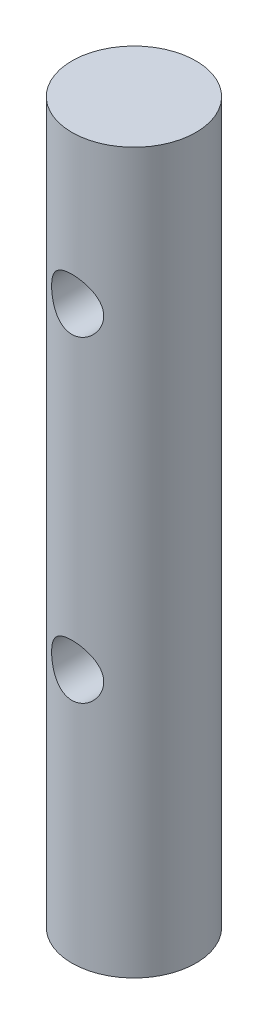
ISO-10303-21;
HEADER;
FILE_DESCRIPTION(('STEP AP214'),'2;1');
FILE_NAME('part.step','',(''),(''),'','','');
FILE_SCHEMA(('AUTOMOTIVE_DESIGN { 1 0 10303 214 1 1 1 1 }'));
ENDSEC;
DATA;
#1=APPLICATION_CONTEXT('core data for automotive mechanical design processes');
#2=APPLICATION_PROTOCOL_DEFINITION('international standard','automotive_design',2000,#1);
#3=PRODUCT_CONTEXT('',#1,'mechanical');
#4=PRODUCT('Part','Part','',(#3));
#5=PRODUCT_RELATED_PRODUCT_CATEGORY('part','',(#4));
#6=PRODUCT_DEFINITION_FORMATION('','',#4);
#7=PRODUCT_DEFINITION_CONTEXT('part definition',#1,'design');
#8=PRODUCT_DEFINITION('design','',#6,#7);
#9=PRODUCT_DEFINITION_SHAPE('','',#8);
#10=(LENGTH_UNIT() NAMED_UNIT(*) SI_UNIT(.MILLI.,.METRE.));
#11=(NAMED_UNIT(*) PLANE_ANGLE_UNIT() SI_UNIT($,.RADIAN.));
#12=(NAMED_UNIT(*) SI_UNIT($,.STERADIAN.) SOLID_ANGLE_UNIT());
#13=UNCERTAINTY_MEASURE_WITH_UNIT(LENGTH_MEASURE(1.E-05),#10,'distance_accuracy_value','');
#14=(GEOMETRIC_REPRESENTATION_CONTEXT(3) GLOBAL_UNCERTAINTY_ASSIGNED_CONTEXT((#13)) GLOBAL_UNIT_ASSIGNED_CONTEXT((#10,
#11,#12)) REPRESENTATION_CONTEXT('',''));
#15=CARTESIAN_POINT('',(0.,0.,0.));
#16=DIRECTION('',(0.,0.,1.));
#17=DIRECTION('',(1.,0.,0.));
#18=AXIS2_PLACEMENT_3D('',#15,#16,#17);
#19=CARTESIAN_POINT('',(0.,58.,0.));
#20=DIRECTION('',(0.,-1.,0.));
#21=DIRECTION('',(0.,0.,-1.));
#22=AXIS2_PLACEMENT_3D('',#19,#20,#21);
#23=CYLINDRICAL_SURFACE('',#22,5.);
#24=CARTESIAN_POINT('',(0.,48.1,-5.));
#25=CARTESIAN_POINT('',(-0.112421260581154,48.0999912513358,-4.99999333081063));
#26=CARTESIAN_POINT('',(-0.225000407186862,48.0909214164188,-4.99616592841195));
#27=CARTESIAN_POINT('',(-0.446972248377445,48.0549745053768,-4.98123118003201));
#28=CARTESIAN_POINT('',(-0.556355935732331,48.0280513734512,-4.97010500635269));
#29=CARTESIAN_POINT('',(-0.768350398152641,47.9575669353113,-4.94176430599483));
#30=CARTESIAN_POINT('',(-0.870982883258441,47.9140623611996,-4.92457055376414));
#31=CARTESIAN_POINT('',(-1.06739278830026,47.8118871486583,-4.8857658190477));
#32=CARTESIAN_POINT('',(-1.16117280038009,47.7532209687109,-4.8641561355186));
#33=CARTESIAN_POINT('',(-1.3421338261388,47.6192383747268,-4.81744880427698));
#34=CARTESIAN_POINT('',(-1.42880573971969,47.5432749625455,-4.79223574286274));
#35=CARTESIAN_POINT('',(-1.58861874618107,47.3782228521662,-4.74165902719199));
#36=CARTESIAN_POINT('',(-1.66175260846298,47.2891271854696,-4.71629529988631));
#37=CARTESIAN_POINT('',(-1.79604183081054,47.0949219517323,-4.66686358992508));
#38=CARTESIAN_POINT('',(-1.85641196230061,46.989233155181,-4.64292449321021));
#39=CARTESIAN_POINT('',(-1.95829034529051,46.7680506363567,-4.60088674913594));
#40=CARTESIAN_POINT('',(-1.99980846754018,46.6525620828365,-4.58278504680928));
#41=CARTESIAN_POINT('',(-2.06069339629843,46.4209186251976,-4.55572282316871));
#42=CARTESIAN_POINT('',(-2.08104088310876,46.3050703250742,-4.54635990340002));
#43=CARTESIAN_POINT('',(-2.10206556458631,46.0712546231971,-4.53668036024208));
#44=CARTESIAN_POINT('',(-2.10275385885089,45.9532884548446,-4.53635863218973));
#45=CARTESIAN_POINT('',(-2.08517838863869,45.7284272657301,-4.54445782632958));
#46=CARTESIAN_POINT('',(-2.06839112114071,45.621387346636,-4.55219766109081));
#47=CARTESIAN_POINT('',(-2.01882069425823,45.4118140301093,-4.57439532890143));
#48=CARTESIAN_POINT('',(-1.98603441325927,45.3092815163873,-4.58885447294869));
#49=CARTESIAN_POINT('',(-1.9047552653891,45.1090228101453,-4.62318960000861));
#50=CARTESIAN_POINT('',(-1.8559407276577,45.0114467919097,-4.64317507109548));
#51=CARTESIAN_POINT('',(-1.74421855126709,44.8254875192443,-4.6862864975772));
#52=CARTESIAN_POINT('',(-1.68130530506479,44.7371079430947,-4.70941370110216));
#53=CARTESIAN_POINT('',(-1.53682141436928,44.5640504268353,-4.7586218987971));
#54=CARTESIAN_POINT('',(-1.4541115363858,44.480344491469,-4.78478586969401));
#55=CARTESIAN_POINT('',(-1.27557303481868,44.3276620651184,-4.83544396849842));
#56=CARTESIAN_POINT('',(-1.17974124865652,44.258689135302,-4.85993769171256));
#57=CARTESIAN_POINT('',(-0.974684985251582,44.1359738450041,-4.90522758617355));
#58=CARTESIAN_POINT('',(-0.865196096354342,44.0826329332761,-4.92592190978332));
#59=CARTESIAN_POINT('',(-0.637707645332218,43.9954695201198,-4.96049707707325));
#60=CARTESIAN_POINT('',(-0.519712906376768,43.9616360535945,-4.97438174778904));
#61=CARTESIAN_POINT('',(-0.286679920590253,43.9164964343609,-4.99305470954801));
#62=CARTESIAN_POINT('',(-0.171936368129356,43.9038862120167,-4.9983686606607));
#63=CARTESIAN_POINT('',(0.0581412446748186,43.8976556572538,-5.00098385227943));
#64=CARTESIAN_POINT('',(0.173475122118156,43.9040297609993,-4.99828744042502));
#65=CARTESIAN_POINT('',(0.395312373831663,43.9346587430673,-4.98552504990215));
#66=CARTESIAN_POINT('',(0.501967273863915,43.9579925247287,-4.9758388790051));
#67=CARTESIAN_POINT('',(0.709728637835151,44.0205906827834,-4.95047932164883));
#68=CARTESIAN_POINT('',(0.810834401783573,44.0598570637601,-4.93480518181903));
#69=CARTESIAN_POINT('',(1.00818189714743,44.1544869561539,-4.8983626516293));
#70=CARTESIAN_POINT('',(1.10417428723488,44.2103134514804,-4.87745088709504));
#71=CARTESIAN_POINT('',(1.2857730017409,44.3359708733449,-4.83275775989047));
#72=CARTESIAN_POINT('',(1.37137493586437,44.4058076868507,-4.80897519262204));
#73=CARTESIAN_POINT('',(1.53629380491232,44.5634290615289,-4.75896603015301));
#74=CARTESIAN_POINT('',(1.61470399849415,44.6521482285297,-4.73268731102285));
#75=CARTESIAN_POINT('',(1.75578239792248,44.8418945785711,-4.68218504424202));
#76=CARTESIAN_POINT('',(1.81844681280032,44.9429247169353,-4.65796199244367));
#77=CARTESIAN_POINT('',(1.92699302654219,45.1566323377572,-4.61412955516252));
#78=CARTESIAN_POINT('',(1.97260446871616,45.2694638769173,-4.59459611805935));
#79=CARTESIAN_POINT('',(2.04378702108546,45.5022855598323,-4.56338397318404));
#80=CARTESIAN_POINT('',(2.06937501482838,45.6222695806153,-4.55169864915186));
#81=CARTESIAN_POINT('',(2.098093753164,45.8559122777025,-4.53852721320537));
#82=CARTESIAN_POINT('',(2.10281966121278,45.9693349012228,-4.53631703032196));
#83=CARTESIAN_POINT('',(2.09395263112575,46.1952929462249,-4.54041709192145));
#84=CARTESIAN_POINT('',(2.0803626157943,46.3078285063796,-4.54672597695537));
#85=CARTESIAN_POINT('',(2.03659654382614,46.5232401848228,-4.56648699353873));
#86=CARTESIAN_POINT('',(2.00724892567788,46.626320610286,-4.57958128170967));
#87=CARTESIAN_POINT('',(1.93361811208319,46.826114240217,-4.61115138706684));
#88=CARTESIAN_POINT('',(1.88933070598751,46.9228256404356,-4.6296287212173));
#89=CARTESIAN_POINT('',(1.78398506506628,47.1135418518623,-4.67127236761429));
#90=CARTESIAN_POINT('',(1.72207244546472,47.2070265834229,-4.69465512938921));
#91=CARTESIAN_POINT('',(1.5844223678344,47.3827788256602,-4.74288120419634));
#92=CARTESIAN_POINT('',(1.50867999331674,47.4650423289533,-4.76772503450352));
#93=CARTESIAN_POINT('',(1.33881414331682,47.6223262248237,-4.81829681676583));
#94=CARTESIAN_POINT('',(1.24374163979691,47.6963503535757,-4.84395273633481));
#95=CARTESIAN_POINT('',(1.04160910493706,47.8274504328955,-4.89140406157461));
#96=CARTESIAN_POINT('',(0.934543653723438,47.8845186778333,-4.91319771021995));
#97=CARTESIAN_POINT('',(0.712909694659775,47.9788868855152,-4.9501639165207));
#98=CARTESIAN_POINT('',(0.598488891919439,48.0164889374133,-4.96543696653597));
#99=CARTESIAN_POINT('',(0.423046442527797,48.0578272578272,-4.98242021609108));
#100=CARTESIAN_POINT('',(0.363983932156321,48.0690926050424,-4.98709206933622));
#101=CARTESIAN_POINT('',(0.244993842675942,48.086523604976,-4.99434801176813));
#102=CARTESIAN_POINT('',(0.185066849625886,48.0926925613123,-4.99693345339788));
#103=CARTESIAN_POINT('',(0.0833788914689154,48.0987597905083,-4.99947925927613));
#104=CARTESIAN_POINT('',(0.0417003073719692,48.1000032451334,-5.00000247379584));
#105=CARTESIAN_POINT('',(0.,48.1,-5.));
#106=B_SPLINE_CURVE_WITH_KNOTS('',3,(#24,#25,#26,#27,#28,#29,#30,#31,#32,#33,#34,#35,#36,#37,
#38,#39,#40,#41,#42,#43,#44,#45,#46,#47,#48,#49,#50,#51,#52,#53,#54,#55,#56,#57,#58,#59,#60,#61,
#62,#63,#64,#65,#66,#67,#68,#69,#70,#71,#72,#73,#74,#75,#76,#77,#78,#79,#80,#81,#82,#83,#84,#85,
#86,#87,#88,#89,#90,#91,#92,#93,#94,#95,#96,#97,#98,#99,#100,#101,#102,#103,#104,#105),
.UNSPECIFIED.,.T.,.F.,(4,2,2,2,2,2,2,2,2,2,2,2,2,2,2,2,2,2,2,2,2,2,2,2,2,2,2,2,2,2,2,2,2,2,2,2,
2,2,2,2,4),(0.,0.337117852409668,0.675108761991063,1.0119534948119,1.34869928621511,
1.70109212353727,2.05367263229609,2.42394551964458,2.79402431110358,3.14607251211167,
3.49792194246532,3.82228185888045,4.14670508743038,4.47808378319006,4.809594514361,
5.16961532097002,5.5297230512783,5.89839924827032,6.26686801055252,6.61173647653921,
6.95650388006772,7.28382587678936,7.61118906878411,7.94874145558542,8.28643597605333,
8.64863382013132,9.01091878393075,9.37872565541545,9.74622206108766,10.0850701575655,
10.4238641880037,10.7463772236013,11.0689812327413,11.4111551885347,11.7534510251225,
12.1212491138851,12.4892140943469,12.851283305836,13.0320009112093,13.2126012784391,
13.3376480711311),.UNSPECIFIED.);
#107=CARTESIAN_POINT('',(0.,48.1,-5.));
#108=VERTEX_POINT('',#107);
#109=EDGE_CURVE('E10',#108,#108,#106,.T.);
#110=ORIENTED_EDGE('',*,*,#109,.T.);
#111=EDGE_LOOP('',(#110));
#112=FACE_BOUND('',#111,.T.);
#113=CARTESIAN_POINT('',(2.1,46.,4.53762052181537));
#114=CARTESIAN_POINT('',(2.09999093921855,45.8880749784205,4.53762943405603));
#115=CARTESIAN_POINT('',(2.09099762013233,45.7759853694105,4.54182056190798));
#116=CARTESIAN_POINT('',(2.05538295735073,45.5550390094382,4.5580436120359));
#117=CARTESIAN_POINT('',(2.02871409890585,45.4461918009732,4.57009666707434));
#118=CARTESIAN_POINT('',(1.95897145018737,45.2353378000576,4.60041935380906));
#119=CARTESIAN_POINT('',(1.91596526359135,45.1333048291412,4.61866333476091));
#120=CARTESIAN_POINT('',(1.81496848628035,44.937930449767,4.65927465681673));
#121=CARTESIAN_POINT('',(1.75698127255649,44.8445870889582,4.68164106832602));
#122=CARTESIAN_POINT('',(1.62374740147949,44.6632827566951,4.72955907129732));
#123=CARTESIAN_POINT('',(1.54770150900604,44.5759376667451,4.755219776632));
#124=CARTESIAN_POINT('',(1.3821867337842,44.4147841990692,4.8059388812481));
#125=CARTESIAN_POINT('',(1.29271265147996,44.3409810896727,4.83099704283744));
#126=CARTESIAN_POINT('',(1.09802657081059,44.2058477020417,4.87901754682324));
#127=CARTESIAN_POINT('',(0.992293792277617,44.1452128213258,4.90183831897403));
#128=CARTESIAN_POINT('',(0.770996800720701,44.0428577065274,4.94147445225016));
#129=CARTESIAN_POINT('',(0.655437046410571,44.0011289481343,4.95829251912189));
#130=CARTESIAN_POINT('',(0.424234923140875,43.9400103162658,4.98325405033125));
#131=CARTESIAN_POINT('',(0.308918758384999,43.9195577499202,4.99180846788813));
#132=CARTESIAN_POINT('',(0.0761953640483121,43.8981358141872,5.00077313697796));
#133=CARTESIAN_POINT('',(-0.0412109829216839,43.8971584076786,5.00118674810494));
#134=CARTESIAN_POINT('',(-0.267045691992889,43.9141629876689,4.99406347006893));
#135=CARTESIAN_POINT('',(-0.375580389240539,43.9309766718821,4.987016486703));
#136=CARTESIAN_POINT('',(-0.588121453972403,43.9810802318956,4.96643913228808));
#137=CARTESIAN_POINT('',(-0.692127486752447,44.0143713232657,4.95290828291428));
#138=CARTESIAN_POINT('',(-0.894571592733619,44.0968770843797,4.92040872616598));
#139=CARTESIAN_POINT('',(-0.992900328996023,44.1463272516458,4.90136010164063));
#140=CARTESIAN_POINT('',(-1.18012201231841,44.2595144447498,4.85968358817454));
#141=CARTESIAN_POINT('',(-1.26901159117052,44.3232565453523,4.83705442870328));
#142=CARTESIAN_POINT('',(-1.44158231126841,44.4685132513924,4.78857382294645));
#143=CARTESIAN_POINT('',(-1.52443735050639,44.5509723739513,4.76260766855617));
#144=CARTESIAN_POINT('',(-1.67550358285698,44.7286640422807,4.71158770832487));
#145=CARTESIAN_POINT('',(-1.74370894230208,44.8239016521529,4.68653426922283));
#146=CARTESIAN_POINT('',(-1.8657088163384,45.0285139943239,4.63934954945429));
#147=CARTESIAN_POINT('',(-1.91893740609922,45.1382581292812,4.61734588251364));
#148=CARTESIAN_POINT('',(-2.00581972046166,45.3663216847683,4.58027780282423));
#149=CARTESIAN_POINT('',(-2.03948770338621,45.4846347881846,4.56520833719538));
#150=CARTESIAN_POINT('',(-2.08417383444552,45.7181949101086,4.54497374255014));
#151=CARTESIAN_POINT('',(-2.09653322865707,45.8331337132931,4.53922360692427));
#152=CARTESIAN_POINT('',(-2.10219613225766,46.0635620670901,4.53660537717822));
#153=CARTESIAN_POINT('',(-2.09550641255737,46.1790514074488,4.53973412710196));
#154=CARTESIAN_POINT('',(-2.0644854956339,46.3993272872141,4.55391594117544));
#155=CARTESIAN_POINT('',(-2.04133871755658,46.5043193336913,4.56443644880221));
#156=CARTESIAN_POINT('',(-1.97963699914412,46.7088394723279,4.59153178478493));
#157=CARTESIAN_POINT('',(-1.94107841865651,46.8083662673147,4.60810804338438));
#158=CARTESIAN_POINT('',(-1.84782427546042,47.0038801835894,4.64630819142541));
#159=CARTESIAN_POINT('',(-1.79251022606962,47.0995349373015,4.66811731814015));
#160=CARTESIAN_POINT('',(-1.66792729869739,47.2806692862802,4.71406644326658));
#161=CARTESIAN_POINT('',(-1.59865231257985,47.3661444016572,4.73820745950212));
#162=CARTESIAN_POINT('',(-1.44134105705572,47.5318759995873,4.78851713924143));
#163=CARTESIAN_POINT('',(-1.35222504205725,47.6111110466619,4.81468784601061));
#164=CARTESIAN_POINT('',(-1.16135980246181,47.7536907646098,4.86425275862533));
#165=CARTESIAN_POINT('',(-1.05960956219155,47.8170341567051,4.88764674095218));
#166=CARTESIAN_POINT('',(-0.845565277086983,47.926000563792,4.92919128625038));
#167=CARTESIAN_POINT('',(-0.733238653288985,47.9715664434711,4.94732489574633));
#168=CARTESIAN_POINT('',(-0.501555646359179,48.0428180751194,4.97614642645122));
#169=CARTESIAN_POINT('',(-0.382203568977619,48.068515870067,4.98683885771429));
#170=CARTESIAN_POINT('',(-0.14897989295794,48.0977675487916,4.99904696623384));
#171=CARTESIAN_POINT('',(-0.0353188535759059,48.1027609068713,5.00115896707158));
#172=CARTESIAN_POINT('',(0.191184274899431,48.0943459505535,4.99762625782031));
#173=CARTESIAN_POINT('',(0.304026507980723,48.0809409544338,4.99198294645839));
#174=CARTESIAN_POINT('',(0.5214419611464,48.0371433091974,4.97388965984129));
#175=CARTESIAN_POINT('',(0.626166665323006,48.0073881392643,4.96169547376985));
#176=CARTESIAN_POINT('',(0.829093659990459,47.9324363984766,4.93184875416263));
#177=CARTESIAN_POINT('',(0.927294717717865,47.8872369189924,4.91419519252122));
#178=CARTESIAN_POINT('',(1.11929420547976,47.7803914279955,4.87413935349895));
#179=CARTESIAN_POINT('',(1.21269118530039,47.7180926836016,4.85155806912578));
#180=CARTESIAN_POINT('',(1.38810582864927,47.5797634231821,4.80431345568246));
#181=CARTESIAN_POINT('',(1.47011916578165,47.5037277115016,4.77964934072141));
#182=CARTESIAN_POINT('',(1.62635503698247,47.3338603683253,4.72886675897238));
#183=CARTESIAN_POINT('',(1.6996433073625,47.239160453718,4.70276600530214));
#184=CARTESIAN_POINT('',(1.82943196277361,47.0380368924478,4.65381604974822));
#185=CARTESIAN_POINT('',(1.88592286779045,46.9316066717568,4.63096868777352));
#186=CARTESIAN_POINT('',(1.9799614156303,46.710020386907,4.59155474401165));
#187=CARTESIAN_POINT('',(2.01759222757015,46.5949052552278,4.57496066839713));
#188=CARTESIAN_POINT('',(2.05880188606211,46.4183283910641,4.55648361689111));
#189=CARTESIAN_POINT('',(2.06999554025264,46.3588778799291,4.55139543388181));
#190=CARTESIAN_POINT('',(2.08721875436019,46.2390931276328,4.54352453834359));
#191=CARTESIAN_POINT('',(2.09325191115689,46.1787595318658,4.54074022005941));
#192=CARTESIAN_POINT('',(2.09888970982883,46.0788982996772,4.53813405720839));
#193=CARTESIAN_POINT('',(2.10000319439566,46.039459378358,4.53761737978805));
#194=CARTESIAN_POINT('',(2.1,46.,4.53762052181537));
#195=B_SPLINE_CURVE_WITH_KNOTS('',3,(#113,#114,#115,#116,#117,#118,#119,#120,#121,#122,#123,
#124,#125,#126,#127,#128,#129,#130,#131,#132,#133,#134,#135,#136,#137,#138,#139,#140,#141,#142,
#143,#144,#145,#146,#147,#148,#149,#150,#151,#152,#153,#154,#155,#156,#157,#158,#159,#160,#161,
#162,#163,#164,#165,#166,#167,#168,#169,#170,#171,#172,#173,#174,#175,#176,#177,#178,#179,#180,
#181,#182,#183,#184,#185,#186,#187,#188,#189,#190,#191,#192,#193,#194),.UNSPECIFIED.,.T.,.F.,(4,
2,2,2,2,2,2,2,2,2,2,2,2,2,2,2,2,2,2,2,2,2,2,2,2,2,2,2,2,2,2,2,2,2,2,2,2,2,2,2,4),(0.,
0.335635656606179,0.672177236307958,1.00734111814836,1.34242951388391,1.69673924977881,
2.05118653430915,2.42129877812726,2.79124398086996,3.14166571369558,3.49194282946524,
3.82056640937212,4.14921423608075,4.48288287547887,4.81667018174637,5.17430973536724,
5.53209144212976,5.90198342971284,6.27160545236007,6.61697414039906,6.9622200842192,
7.28484865641397,7.60755347613732,7.9440312851303,8.28065662947255,8.64521235173312,
9.00979739985345,9.37554472437895,9.74107017809823,10.0807065690479,10.4202817121371,
10.7474704702579,11.0747208818873,11.4168078835367,11.7590245427136,12.1249656183702,
12.4911128317486,12.8556308833965,13.0375398024423,13.2193218269542,13.3376508134272),.UNSPECIFIED.);
#196=CARTESIAN_POINT('',(2.1,46.,4.53762052181537));
#197=VERTEX_POINT('',#196);
#198=EDGE_CURVE('E43',#197,#197,#195,.T.);
#199=ORIENTED_EDGE('',*,*,#198,.T.);
#200=EDGE_LOOP('',(#199));
#201=FACE_BOUND('',#200,.T.);
#202=CARTESIAN_POINT('',(0.,22.55,-5.));
#203=CARTESIAN_POINT('',(-0.112421260581153,22.5499912513358,-4.99999333081063));
#204=CARTESIAN_POINT('',(-0.22500040718686,22.5409214164188,-4.99616592841196));
#205=CARTESIAN_POINT('',(-0.446972248377442,22.5049745053768,-4.98123118003201));
#206=CARTESIAN_POINT('',(-0.556355935732329,22.4780513734512,-4.97010500635269));
#207=CARTESIAN_POINT('',(-0.768350398152641,22.4075669353113,-4.94176430599483));
#208=CARTESIAN_POINT('',(-0.870982883258443,22.3640623611996,-4.92457055376414));
#209=CARTESIAN_POINT('',(-1.06739278830026,22.2618871486583,-4.8857658190477));
#210=CARTESIAN_POINT('',(-1.16117280038009,22.2032209687109,-4.8641561355186));
#211=CARTESIAN_POINT('',(-1.3421338261388,22.0692383747268,-4.81744880427698));
#212=CARTESIAN_POINT('',(-1.42880573971969,21.9932749625455,-4.79223574286274));
#213=CARTESIAN_POINT('',(-1.58861874618107,21.8282228521662,-4.74165902719199));
#214=CARTESIAN_POINT('',(-1.66175260846298,21.7391271854696,-4.71629529988631));
#215=CARTESIAN_POINT('',(-1.79604183081054,21.5449219517323,-4.66686358992508));
#216=CARTESIAN_POINT('',(-1.85641196230061,21.439233155181,-4.64292449321021));
#217=CARTESIAN_POINT('',(-1.95829034529051,21.2180506363567,-4.60088674913593));
#218=CARTESIAN_POINT('',(-1.99980846754018,21.1025620828365,-4.58278504680928));
#219=CARTESIAN_POINT('',(-2.06069339629843,20.8709186251976,-4.55572282316871));
#220=CARTESIAN_POINT('',(-2.08104088310876,20.7550703250742,-4.54635990340002));
#221=CARTESIAN_POINT('',(-2.10206556458631,20.5212546231971,-4.53668036024208));
#222=CARTESIAN_POINT('',(-2.10275385885089,20.4032884548446,-4.53635863218972));
#223=CARTESIAN_POINT('',(-2.08517838863869,20.1784272657301,-4.54445782632957));
#224=CARTESIAN_POINT('',(-2.06839112114071,20.071387346636,-4.55219766109081));
#225=CARTESIAN_POINT('',(-2.01882069425824,19.8618140301093,-4.57439532890142));
#226=CARTESIAN_POINT('',(-1.98603441325927,19.7592815163873,-4.58885447294869));
#227=CARTESIAN_POINT('',(-1.90475526538911,19.5590228101453,-4.62318960000861));
#228=CARTESIAN_POINT('',(-1.85594072765771,19.4614467919097,-4.64317507109548));
#229=CARTESIAN_POINT('',(-1.74421855126709,19.2754875192443,-4.68628649757719));
#230=CARTESIAN_POINT('',(-1.68130530506479,19.1871079430947,-4.70941370110216));
#231=CARTESIAN_POINT('',(-1.53682141436929,19.0140504268353,-4.7586218987971));
#232=CARTESIAN_POINT('',(-1.45411153638581,18.930344491469,-4.78478586969401));
#233=CARTESIAN_POINT('',(-1.27557303481869,18.7776620651184,-4.83544396849842));
#234=CARTESIAN_POINT('',(-1.17974124865653,18.708689135302,-4.85993769171256));
#235=CARTESIAN_POINT('',(-0.974684985251588,18.5859738450041,-4.90522758617355));
#236=CARTESIAN_POINT('',(-0.865196096354347,18.5326329332761,-4.92592190978332));
#237=CARTESIAN_POINT('',(-0.637707645332221,18.4454695201198,-4.96049707707325));
#238=CARTESIAN_POINT('',(-0.51971290637677,18.4116360535945,-4.97438174778904));
#239=CARTESIAN_POINT('',(-0.286679920590254,18.3664964343609,-4.99305470954801));
#240=CARTESIAN_POINT('',(-0.171936368129358,18.3538862120167,-4.9983686606607));
#241=CARTESIAN_POINT('',(0.0581412446748168,18.3476556572538,-5.00098385227943));
#242=CARTESIAN_POINT('',(0.173475122118155,18.3540297609993,-4.99828744042502));
#243=CARTESIAN_POINT('',(0.395312373831662,18.3846587430673,-4.98552504990215));
#244=CARTESIAN_POINT('',(0.501967273863915,18.4079925247287,-4.9758388790051));
#245=CARTESIAN_POINT('',(0.709728637835151,18.4705906827834,-4.95047932164883));
#246=CARTESIAN_POINT('',(0.810834401783572,18.5098570637601,-4.93480518181903));
#247=CARTESIAN_POINT('',(1.00818189714743,18.6044869561538,-4.8983626516293));
#248=CARTESIAN_POINT('',(1.10417428723488,18.6603134514804,-4.87745088709504));
#249=CARTESIAN_POINT('',(1.2857730017409,18.7859708733449,-4.83275775989047));
#250=CARTESIAN_POINT('',(1.37137493586437,18.8558076868506,-4.80897519262205));
#251=CARTESIAN_POINT('',(1.53629380491232,19.0134290615289,-4.75896603015302));
#252=CARTESIAN_POINT('',(1.61470399849415,19.1021482285297,-4.73268731102285));
#253=CARTESIAN_POINT('',(1.75578239792247,19.2918945785711,-4.68218504424202));
#254=CARTESIAN_POINT('',(1.81844681280032,19.3929247169353,-4.65796199244367));
#255=CARTESIAN_POINT('',(1.92699302654219,19.6066323377572,-4.61412955516252));
#256=CARTESIAN_POINT('',(1.97260446871616,19.7194638769173,-4.59459611805935));
#257=CARTESIAN_POINT('',(2.04378702108546,19.9522855598323,-4.56338397318404));
#258=CARTESIAN_POINT('',(2.06937501482838,20.0722695806153,-4.55169864915186));
#259=CARTESIAN_POINT('',(2.098093753164,20.3059122777025,-4.53852721320537));
#260=CARTESIAN_POINT('',(2.10281966121278,20.4193349012228,-4.53631703032196));
#261=CARTESIAN_POINT('',(2.09395263112575,20.6452929462249,-4.54041709192145));
#262=CARTESIAN_POINT('',(2.0803626157943,20.7578285063796,-4.54672597695537));
#263=CARTESIAN_POINT('',(2.03659654382614,20.9732401848228,-4.56648699353873));
#264=CARTESIAN_POINT('',(2.00724892567788,21.076320610286,-4.57958128170966));
#265=CARTESIAN_POINT('',(1.93361811208319,21.276114240217,-4.61115138706683));
#266=CARTESIAN_POINT('',(1.88933070598751,21.3728256404356,-4.6296287212173));
#267=CARTESIAN_POINT('',(1.78398506506628,21.5635418518623,-4.67127236761429));
#268=CARTESIAN_POINT('',(1.72207244546473,21.6570265834229,-4.69465512938921));
#269=CARTESIAN_POINT('',(1.5844223678344,21.8327788256602,-4.74288120419634));
#270=CARTESIAN_POINT('',(1.50867999331674,21.9150423289533,-4.76772503450352));
#271=CARTESIAN_POINT('',(1.33881414331683,22.0723262248237,-4.81829681676583));
#272=CARTESIAN_POINT('',(1.24374163979692,22.1463503535757,-4.84395273633481));
#273=CARTESIAN_POINT('',(1.04160910493706,22.2774504328955,-4.89140406157461));
#274=CARTESIAN_POINT('',(0.934543653723441,22.3345186778333,-4.91319771021994));
#275=CARTESIAN_POINT('',(0.712909694659778,22.4288868855152,-4.9501639165207));
#276=CARTESIAN_POINT('',(0.598488891919442,22.4664889374133,-4.96543696653597));
#277=CARTESIAN_POINT('',(0.423046442527801,22.5078272578272,-4.98242021609108));
#278=CARTESIAN_POINT('',(0.363983932156325,22.5190926050424,-4.98709206933622));
#279=CARTESIAN_POINT('',(0.244993842675946,22.536523604976,-4.99434801176813));
#280=CARTESIAN_POINT('',(0.185066849625889,22.5426925613123,-4.99693345339788));
#281=CARTESIAN_POINT('',(0.0833788914689173,22.5487597905083,-4.99947925927613));
#282=CARTESIAN_POINT('',(0.0417003073719702,22.5500032451334,-5.00000247379584));
#283=CARTESIAN_POINT('',(0.,22.55,-5.));
#284=B_SPLINE_CURVE_WITH_KNOTS('',3,(#202,#203,#204,#205,#206,#207,#208,#209,#210,#211,#212,
#213,#214,#215,#216,#217,#218,#219,#220,#221,#222,#223,#224,#225,#226,#227,#228,#229,#230,#231,
#232,#233,#234,#235,#236,#237,#238,#239,#240,#241,#242,#243,#244,#245,#246,#247,#248,#249,#250,
#251,#252,#253,#254,#255,#256,#257,#258,#259,#260,#261,#262,#263,#264,#265,#266,#267,#268,#269,
#270,#271,#272,#273,#274,#275,#276,#277,#278,#279,#280,#281,#282,#283),.UNSPECIFIED.,.T.,.F.,(4,
2,2,2,2,2,2,2,2,2,2,2,2,2,2,2,2,2,2,2,2,2,2,2,2,2,2,2,2,2,2,2,2,2,2,2,2,2,2,2,4),(0.,
0.337117852409665,0.675108761991064,1.0119534948119,1.34869928621511,1.70109212353727,
2.0536726322961,2.42394551964459,2.79402431110359,3.14607251211166,3.49792194246532,
3.82228185888045,4.14670508743037,4.47808378319006,4.809594514361,5.16961532097002,
5.5297230512783,5.89839924827032,6.26686801055252,6.61173647653922,6.95650388006773,
7.28382587678937,7.61118906878411,7.94874145558542,8.28643597605333,8.64863382013131,
9.01091878393076,9.37872565541546,9.74622206108767,10.0850701575655,10.4238641880037,
10.7463772236013,11.0689812327413,11.4111551885348,11.7534510251225,12.1212491138851,
12.4892140943469,12.8512833058361,13.0320009112093,13.2126012784391,13.3376480711311),.UNSPECIFIED.);
#285=CARTESIAN_POINT('',(0.,22.55,-5.));
#286=VERTEX_POINT('',#285);
#287=EDGE_CURVE('E47',#286,#286,#284,.T.);
#288=ORIENTED_EDGE('',*,*,#287,.T.);
#289=EDGE_LOOP('',(#288));
#290=FACE_BOUND('',#289,.T.);
#291=CARTESIAN_POINT('',(2.1,20.45,4.53762052181537));
#292=CARTESIAN_POINT('',(2.09999093921855,20.3380749784205,4.53762943405603));
#293=CARTESIAN_POINT('',(2.09099762013233,20.2259853694105,4.54182056190798));
#294=CARTESIAN_POINT('',(2.05538295735073,20.0050390094382,4.5580436120359));
#295=CARTESIAN_POINT('',(2.02871409890585,19.8961918009732,4.57009666707434));
#296=CARTESIAN_POINT('',(1.95897145018737,19.6853378000576,4.60041935380906));
#297=CARTESIAN_POINT('',(1.91596526359135,19.5833048291412,4.61866333476091));
#298=CARTESIAN_POINT('',(1.81496848628035,19.387930449767,4.65927465681673));
#299=CARTESIAN_POINT('',(1.75698127255649,19.2945870889582,4.68164106832602));
#300=CARTESIAN_POINT('',(1.62374740147949,19.1132827566952,4.72955907129732));
#301=CARTESIAN_POINT('',(1.54770150900604,19.0259376667451,4.755219776632));
#302=CARTESIAN_POINT('',(1.38218673378419,18.8647841990692,4.8059388812481));
#303=CARTESIAN_POINT('',(1.29271265147996,18.7909810896727,4.83099704283744));
#304=CARTESIAN_POINT('',(1.09802657081059,18.6558477020417,4.87901754682324));
#305=CARTESIAN_POINT('',(0.992293792277617,18.5952128213258,4.90183831897403));
#306=CARTESIAN_POINT('',(0.7709968007207,18.4928577065274,4.94147445225016));
#307=CARTESIAN_POINT('',(0.65543704641057,18.4511289481343,4.95829251912189));
#308=CARTESIAN_POINT('',(0.424234923140873,18.3900103162658,4.98325405033125));
#309=CARTESIAN_POINT('',(0.308918758384998,18.3695577499202,4.99180846788813));
#310=CARTESIAN_POINT('',(0.0761953640483108,18.3481358141872,5.00077313697796));
#311=CARTESIAN_POINT('',(-0.0412109829216846,18.3471584076786,5.00118674810494));
#312=CARTESIAN_POINT('',(-0.267045691992889,18.3641629876689,4.99406347006893));
#313=CARTESIAN_POINT('',(-0.375580389240539,18.3809766718821,4.987016486703));
#314=CARTESIAN_POINT('',(-0.588121453972403,18.4310802318956,4.96643913228808));
#315=CARTESIAN_POINT('',(-0.692127486752448,18.4643713232657,4.95290828291428));
#316=CARTESIAN_POINT('',(-0.89457159273362,18.5468770843797,4.92040872616598));
#317=CARTESIAN_POINT('',(-0.992900328996025,18.5963272516458,4.90136010164063));
#318=CARTESIAN_POINT('',(-1.18012201231841,18.7095144447498,4.85968358817454));
#319=CARTESIAN_POINT('',(-1.26901159117052,18.7732565453523,4.83705442870328));
#320=CARTESIAN_POINT('',(-1.44158231126841,18.9185132513923,4.78857382294645));
#321=CARTESIAN_POINT('',(-1.52443735050639,19.0009723739513,4.76260766855617));
#322=CARTESIAN_POINT('',(-1.67550358285698,19.1786640422807,4.71158770832487));
#323=CARTESIAN_POINT('',(-1.74370894230208,19.2739016521529,4.68653426922283));
#324=CARTESIAN_POINT('',(-1.8657088163384,19.4785139943239,4.63934954945429));
#325=CARTESIAN_POINT('',(-1.91893740609922,19.5882581292812,4.61734588251364));
#326=CARTESIAN_POINT('',(-2.00581972046166,19.8163216847683,4.58027780282422));
#327=CARTESIAN_POINT('',(-2.03948770338621,19.9346347881846,4.56520833719538));
#328=CARTESIAN_POINT('',(-2.08417383444552,20.1681949101086,4.54497374255014));
#329=CARTESIAN_POINT('',(-2.09653322865707,20.2831337132931,4.53922360692427));
#330=CARTESIAN_POINT('',(-2.10219613225766,20.5135620670901,4.53660537717821));
#331=CARTESIAN_POINT('',(-2.09550641255738,20.6290514074488,4.53973412710196));
#332=CARTESIAN_POINT('',(-2.0644854956339,20.8493272872141,4.55391594117544));
#333=CARTESIAN_POINT('',(-2.04133871755658,20.9543193336913,4.56443644880221));
#334=CARTESIAN_POINT('',(-1.97963699914412,21.1588394723279,4.59153178478493));
#335=CARTESIAN_POINT('',(-1.94107841865651,21.2583662673147,4.60810804338438));
#336=CARTESIAN_POINT('',(-1.84782427546042,21.4538801835894,4.64630819142541));
#337=CARTESIAN_POINT('',(-1.79251022606962,21.5495349373015,4.66811731814016));
#338=CARTESIAN_POINT('',(-1.66792729869739,21.7306692862802,4.71406644326658));
#339=CARTESIAN_POINT('',(-1.59865231257984,21.8161444016573,4.73820745950212));
#340=CARTESIAN_POINT('',(-1.44134105705571,21.9818759995873,4.78851713924143));
#341=CARTESIAN_POINT('',(-1.35222504205725,22.0611110466618,4.81468784601061));
#342=CARTESIAN_POINT('',(-1.16135980246181,22.2036907646098,4.86425275862533));
#343=CARTESIAN_POINT('',(-1.05960956219156,22.2670341567051,4.88764674095218));
#344=CARTESIAN_POINT('',(-0.845565277086986,22.376000563792,4.92919128625038));
#345=CARTESIAN_POINT('',(-0.733238653288986,22.4215664434711,4.94732489574633));
#346=CARTESIAN_POINT('',(-0.501555646359178,22.4928180751194,4.97614642645122));
#347=CARTESIAN_POINT('',(-0.382203568977617,22.518515870067,4.98683885771429));
#348=CARTESIAN_POINT('',(-0.148979892957937,22.5477675487916,4.99904696623384));
#349=CARTESIAN_POINT('',(-0.0353188535759025,22.5527609068713,5.00115896707158));
#350=CARTESIAN_POINT('',(0.191184274899433,22.5443459505535,4.99762625782031));
#351=CARTESIAN_POINT('',(0.304026507980725,22.5309409544338,4.99198294645839));
#352=CARTESIAN_POINT('',(0.521441961146401,22.4871433091974,4.97388965984129));
#353=CARTESIAN_POINT('',(0.626166665323006,22.4573881392643,4.96169547376985));
#354=CARTESIAN_POINT('',(0.82909365999046,22.3824363984765,4.93184875416263));
#355=CARTESIAN_POINT('',(0.927294717717866,22.3372369189924,4.91419519252122));
#356=CARTESIAN_POINT('',(1.11929420547976,22.2303914279955,4.87413935349895));
#357=CARTESIAN_POINT('',(1.21269118530039,22.1680926836016,4.85155806912578));
#358=CARTESIAN_POINT('',(1.38810582864927,22.0297634231821,4.80431345568246));
#359=CARTESIAN_POINT('',(1.47011916578165,21.9537277115016,4.77964934072141));
#360=CARTESIAN_POINT('',(1.62635503698247,21.7838603683253,4.72886675897237));
#361=CARTESIAN_POINT('',(1.6996433073625,21.689160453718,4.70276600530214));
#362=CARTESIAN_POINT('',(1.82943196277361,21.4880368924479,4.65381604974822));
#363=CARTESIAN_POINT('',(1.88592286779045,21.3816066717568,4.63096868777352));
#364=CARTESIAN_POINT('',(1.9799614156303,21.160020386907,4.59155474401165));
#365=CARTESIAN_POINT('',(2.01759222757015,21.0449052552278,4.57496066839713));
#366=CARTESIAN_POINT('',(2.05880188606212,20.8683283910641,4.55648361689111));
#367=CARTESIAN_POINT('',(2.06999554025264,20.808877879929,4.5513954338818));
#368=CARTESIAN_POINT('',(2.08721875436019,20.6890931276328,4.54352453834359));
#369=CARTESIAN_POINT('',(2.09325191115689,20.6287595318658,4.54074022005941));
#370=CARTESIAN_POINT('',(2.09888970982883,20.5288982996772,4.53813405720839));
#371=CARTESIAN_POINT('',(2.10000319439566,20.489459378358,4.53761737978805));
#372=CARTESIAN_POINT('',(2.1,20.45,4.53762052181537));
#373=B_SPLINE_CURVE_WITH_KNOTS('',3,(#291,#292,#293,#294,#295,#296,#297,#298,#299,#300,#301,
#302,#303,#304,#305,#306,#307,#308,#309,#310,#311,#312,#313,#314,#315,#316,#317,#318,#319,#320,
#321,#322,#323,#324,#325,#326,#327,#328,#329,#330,#331,#332,#333,#334,#335,#336,#337,#338,#339,
#340,#341,#342,#343,#344,#345,#346,#347,#348,#349,#350,#351,#352,#353,#354,#355,#356,#357,#358,
#359,#360,#361,#362,#363,#364,#365,#366,#367,#368,#369,#370,#371,#372),.UNSPECIFIED.,.T.,.F.,(4,
2,2,2,2,2,2,2,2,2,2,2,2,2,2,2,2,2,2,2,2,2,2,2,2,2,2,2,2,2,2,2,2,2,2,2,2,2,2,2,4),(0.,
0.335635656606179,0.672177236307958,1.00734111814836,1.34242951388391,1.69673924977881,
2.05118653430915,2.42129877812726,2.79124398086996,3.14166571369558,3.49194282946524,
3.82056640937212,4.14921423608075,4.48288287547888,4.81667018174637,5.17430973536724,
5.53209144212976,5.90198342971285,6.27160545236008,6.61697414039908,6.96222008421921,
7.28484865641398,7.60755347613733,7.94403128513031,8.28065662947257,8.64521235173312,
9.00979739985345,9.37554472437895,9.74107017809824,10.080706569048,10.4202817121371,
10.7474704702579,11.0747208818873,11.4168078835367,11.7590245427136,12.1249656183702,
12.4911128317486,12.8556308833965,13.0375398024424,13.2193218269542,13.3376508134272),.UNSPECIFIED.);
#374=CARTESIAN_POINT('',(2.1,20.45,4.53762052181537));
#375=VERTEX_POINT('',#374);
#376=EDGE_CURVE('E51',#375,#375,#373,.T.);
#377=ORIENTED_EDGE('',*,*,#376,.T.);
#378=EDGE_LOOP('',(#377));
#379=FACE_BOUND('',#378,.T.);
#380=CARTESIAN_POINT('',(0.,58.,0.));
#381=DIRECTION('',(0.,1.,0.));
#382=DIRECTION('',(0.,0.,1.));
#383=AXIS2_PLACEMENT_3D('',#380,#381,#382);
#384=CIRCLE('',#383,5.);
#385=CARTESIAN_POINT('',(0.,58.,5.));
#386=VERTEX_POINT('',#385);
#387=EDGE_CURVE('E79',#386,#386,#384,.T.);
#388=ORIENTED_EDGE('',*,*,#387,.F.);
#389=EDGE_LOOP('',(#388));
#390=FACE_BOUND('',#389,.T.);
#391=CARTESIAN_POINT('',(0.,0.,0.));
#392=DIRECTION('',(0.,1.,0.));
#393=DIRECTION('',(0.,0.,1.));
#394=AXIS2_PLACEMENT_3D('',#391,#392,#393);
#395=CIRCLE('',#394,5.);
#396=CARTESIAN_POINT('',(0.,0.,5.));
#397=VERTEX_POINT('',#396);
#398=EDGE_CURVE('E80',#397,#397,#395,.T.);
#399=ORIENTED_EDGE('',*,*,#398,.T.);
#400=EDGE_LOOP('',(#399));
#401=FACE_BOUND('',#400,.T.);
#402=ADVANCED_FACE('F32',(#112,#201,#290,#379,#390,#401),#23,.T.);
#403=CARTESIAN_POINT('',(0.,58.,0.));
#404=DIRECTION('',(0.,1.,0.));
#405=DIRECTION('',(0.,0.,1.));
#406=AXIS2_PLACEMENT_3D('',#403,#404,#405);
#407=PLANE('',#406);
#408=ORIENTED_EDGE('',*,*,#387,.T.);
#409=EDGE_LOOP('',(#408));
#410=FACE_BOUND('',#409,.T.);
#411=ADVANCED_FACE('F72',(#410),#407,.T.);
#412=CARTESIAN_POINT('',(0.,0.,0.));
#413=DIRECTION('',(0.,1.,0.));
#414=DIRECTION('',(0.,0.,1.));
#415=AXIS2_PLACEMENT_3D('',#412,#413,#414);
#416=PLANE('',#415);
#417=ORIENTED_EDGE('',*,*,#398,.F.);
#418=EDGE_LOOP('',(#417));
#419=FACE_BOUND('',#418,.T.);
#420=ADVANCED_FACE('F70',(#419),#416,.F.);
#421=CARTESIAN_POINT('',(0.,20.45,-5.));
#422=DIRECTION('',(0.,0.,1.));
#423=DIRECTION('',(1.,0.,0.));
#424=AXIS2_PLACEMENT_3D('',#421,#422,#423);
#425=CYLINDRICAL_SURFACE('',#424,2.1);
#426=ORIENTED_EDGE('',*,*,#376,.F.);
#427=EDGE_LOOP('',(#426));
#428=FACE_BOUND('',#427,.T.);
#429=ORIENTED_EDGE('',*,*,#287,.F.);
#430=EDGE_LOOP('',(#429));
#431=FACE_BOUND('',#430,.T.);
#432=ADVANCED_FACE('F64',(#428,#431),#425,.F.);
#433=CARTESIAN_POINT('',(0.,46.,-5.));
#434=DIRECTION('',(0.,0.,1.));
#435=DIRECTION('',(1.,0.,0.));
#436=AXIS2_PLACEMENT_3D('',#433,#434,#435);
#437=CYLINDRICAL_SURFACE('',#436,2.1);
#438=ORIENTED_EDGE('',*,*,#198,.F.);
#439=EDGE_LOOP('',(#438));
#440=FACE_BOUND('',#439,.T.);
#441=ORIENTED_EDGE('',*,*,#109,.F.);
#442=EDGE_LOOP('',(#441));
#443=FACE_BOUND('',#442,.T.);
#444=ADVANCED_FACE('F61',(#440,#443),#437,.F.);
#445=CLOSED_SHELL('',(#402,#411,#420,#432,#444));
#446=MANIFOLD_SOLID_BREP('B2',#445);
#447=ADVANCED_BREP_SHAPE_REPRESENTATION('',(#18,#446),#14);
#448=SHAPE_DEFINITION_REPRESENTATION(#9,#447);
ENDSEC;
END-ISO-10303-21;
